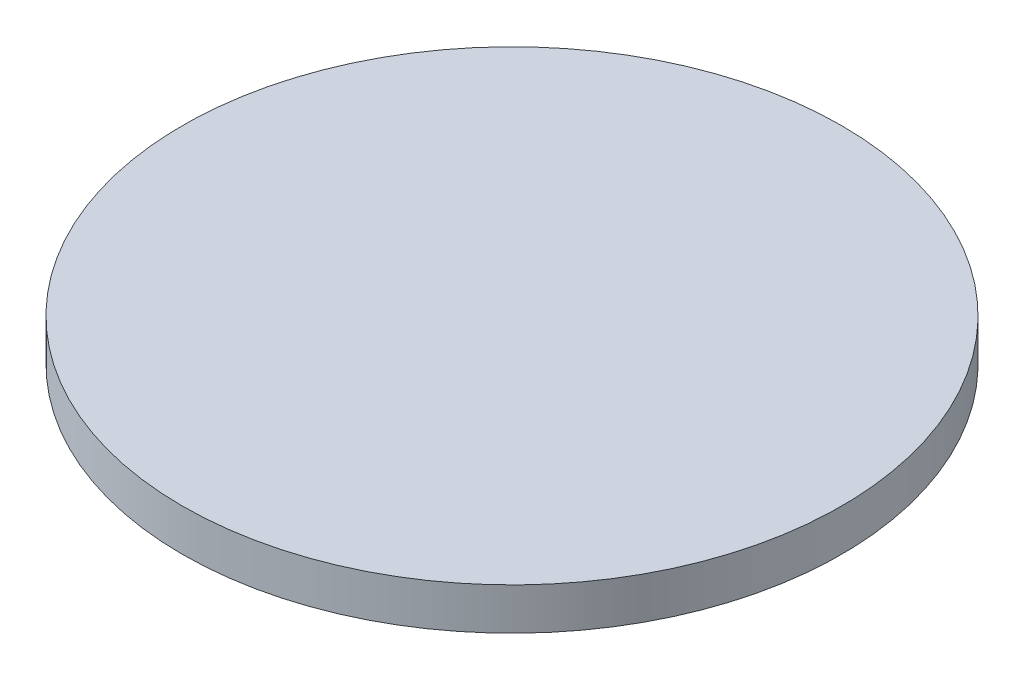
ISO-10303-21;
HEADER;
FILE_DESCRIPTION(('STEP AP214'),'2;1');
FILE_NAME('part.step','',(''),(''),'','','');
FILE_SCHEMA(('AUTOMOTIVE_DESIGN { 1 0 10303 214 1 1 1 1 }'));
ENDSEC;
DATA;
#1=APPLICATION_CONTEXT('core data for automotive mechanical design processes');
#2=APPLICATION_PROTOCOL_DEFINITION('international standard','automotive_design',2000,#1);
#3=PRODUCT_CONTEXT('',#1,'mechanical');
#4=PRODUCT('Part','Part','',(#3));
#5=PRODUCT_RELATED_PRODUCT_CATEGORY('part','',(#4));
#6=PRODUCT_DEFINITION_FORMATION('','',#4);
#7=PRODUCT_DEFINITION_CONTEXT('part definition',#1,'design');
#8=PRODUCT_DEFINITION('design','',#6,#7);
#9=PRODUCT_DEFINITION_SHAPE('','',#8);
#10=(LENGTH_UNIT() NAMED_UNIT(*) SI_UNIT(.MILLI.,.METRE.));
#11=(NAMED_UNIT(*) PLANE_ANGLE_UNIT() SI_UNIT($,.RADIAN.));
#12=(NAMED_UNIT(*) SI_UNIT($,.STERADIAN.) SOLID_ANGLE_UNIT());
#13=UNCERTAINTY_MEASURE_WITH_UNIT(LENGTH_MEASURE(1.E-05),#10,'distance_accuracy_value','');
#14=(GEOMETRIC_REPRESENTATION_CONTEXT(3) GLOBAL_UNCERTAINTY_ASSIGNED_CONTEXT((#13)) GLOBAL_UNIT_ASSIGNED_CONTEXT((#10,
#11,#12)) REPRESENTATION_CONTEXT('',''));
#15=CARTESIAN_POINT('',(0.,0.,0.));
#16=DIRECTION('',(0.,0.,1.));
#17=DIRECTION('',(1.,0.,0.));
#18=AXIS2_PLACEMENT_3D('',#15,#16,#17);
#19=CARTESIAN_POINT('',(0.,6.35,0.));
#20=DIRECTION('',(0.,-1.,0.));
#21=DIRECTION('',(0.,0.,-1.));
#22=AXIS2_PLACEMENT_3D('',#19,#20,#21);
#23=CYLINDRICAL_SURFACE('',#22,50.);
#24=CARTESIAN_POINT('',(0.,6.35,0.));
#25=DIRECTION('',(0.,1.,0.));
#26=DIRECTION('',(0.,0.,1.));
#27=AXIS2_PLACEMENT_3D('',#24,#25,#26);
#28=CIRCLE('',#27,50.);
#29=CARTESIAN_POINT('',(0.,6.35,50.));
#30=VERTEX_POINT('',#29);
#31=EDGE_CURVE('E10',#30,#30,#28,.T.);
#32=ORIENTED_EDGE('',*,*,#31,.F.);
#33=EDGE_LOOP('',(#32));
#34=FACE_BOUND('',#33,.T.);
#35=CARTESIAN_POINT('',(0.,0.,0.));
#36=DIRECTION('',(0.,1.,0.));
#37=DIRECTION('',(0.,0.,1.));
#38=AXIS2_PLACEMENT_3D('',#35,#36,#37);
#39=CIRCLE('',#38,50.);
#40=CARTESIAN_POINT('',(0.,0.,50.));
#41=VERTEX_POINT('',#40);
#42=EDGE_CURVE('E34',#41,#41,#39,.T.);
#43=ORIENTED_EDGE('',*,*,#42,.T.);
#44=EDGE_LOOP('',(#43));
#45=FACE_BOUND('',#44,.T.);
#46=ADVANCED_FACE('F31',(#34,#45),#23,.T.);
#47=CARTESIAN_POINT('',(0.,6.35,0.));
#48=DIRECTION('',(0.,1.,0.));
#49=DIRECTION('',(0.,0.,1.));
#50=AXIS2_PLACEMENT_3D('',#47,#48,#49);
#51=PLANE('',#50);
#52=ORIENTED_EDGE('',*,*,#31,.T.);
#53=EDGE_LOOP('',(#52));
#54=FACE_BOUND('',#53,.T.);
#55=ADVANCED_FACE('F46',(#54),#51,.T.);
#56=CARTESIAN_POINT('',(0.,0.,0.));
#57=DIRECTION('',(0.,1.,0.));
#58=DIRECTION('',(0.,0.,1.));
#59=AXIS2_PLACEMENT_3D('',#56,#57,#58);
#60=PLANE('',#59);
#61=ORIENTED_EDGE('',*,*,#42,.F.);
#62=EDGE_LOOP('',(#61));
#63=FACE_BOUND('',#62,.T.);
#64=ADVANCED_FACE('F44',(#63),#60,.F.);
#65=CLOSED_SHELL('',(#46,#55,#64));
#66=MANIFOLD_SOLID_BREP('B2',#65);
#67=ADVANCED_BREP_SHAPE_REPRESENTATION('',(#18,#66),#14);
#68=SHAPE_DEFINITION_REPRESENTATION(#9,#67);
ENDSEC;
END-ISO-10303-21;
